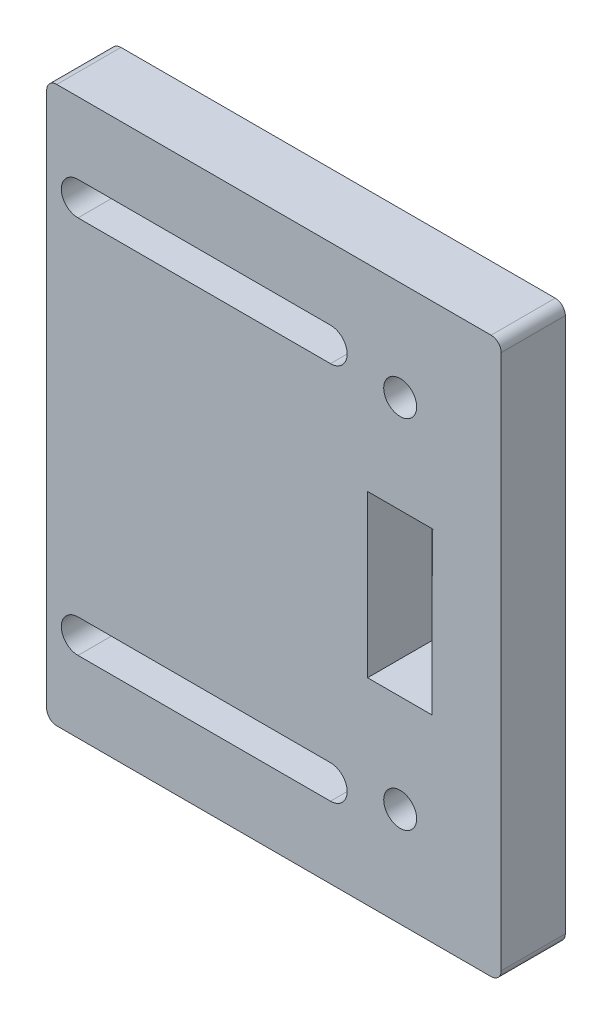
ISO-10303-21;
HEADER;
FILE_DESCRIPTION(('STEP AP214'),'2;1');
FILE_NAME('part.step','',(''),(''),'','','');
FILE_SCHEMA(('AUTOMOTIVE_DESIGN { 1 0 10303 214 1 1 1 1 }'));
ENDSEC;
DATA;
#1=APPLICATION_CONTEXT('core data for automotive mechanical design processes');
#2=APPLICATION_PROTOCOL_DEFINITION('international standard','automotive_design',2000,#1);
#3=PRODUCT_CONTEXT('',#1,'mechanical');
#4=PRODUCT('Part','Part','',(#3));
#5=PRODUCT_RELATED_PRODUCT_CATEGORY('part','',(#4));
#6=PRODUCT_DEFINITION_FORMATION('','',#4);
#7=PRODUCT_DEFINITION_CONTEXT('part definition',#1,'design');
#8=PRODUCT_DEFINITION('design','',#6,#7);
#9=PRODUCT_DEFINITION_SHAPE('','',#8);
#10=(LENGTH_UNIT() NAMED_UNIT(*) SI_UNIT(.MILLI.,.METRE.));
#11=(NAMED_UNIT(*) PLANE_ANGLE_UNIT() SI_UNIT($,.RADIAN.));
#12=(NAMED_UNIT(*) SI_UNIT($,.STERADIAN.) SOLID_ANGLE_UNIT());
#13=UNCERTAINTY_MEASURE_WITH_UNIT(LENGTH_MEASURE(1.E-05),#10,'distance_accuracy_value','');
#14=(GEOMETRIC_REPRESENTATION_CONTEXT(3) GLOBAL_UNCERTAINTY_ASSIGNED_CONTEXT((#13)) GLOBAL_UNIT_ASSIGNED_CONTEXT((#10,
#11,#12)) REPRESENTATION_CONTEXT('',''));
#15=CARTESIAN_POINT('',(0.,0.,0.));
#16=DIRECTION('',(0.,0.,1.));
#17=DIRECTION('',(1.,0.,0.));
#18=AXIS2_PLACEMENT_3D('',#15,#16,#17);
#19=CARTESIAN_POINT('',(0.,0.,0.));
#20=DIRECTION('',(0.,0.,1.));
#21=DIRECTION('',(1.,0.,0.));
#22=AXIS2_PLACEMENT_3D('',#19,#20,#21);
#23=PLANE('',#22);
#24=DIRECTION('',(-1.,0.,0.));
#25=VECTOR('',#24,1.);
#26=CARTESIAN_POINT('',(56.200253658406,-20.785,0.));
#27=LINE('',#26,#25);
#28=CARTESIAN_POINT('',(56.200253658406,-20.785,0.));
#29=VERTEX_POINT('',#28);
#30=CARTESIAN_POINT('',(6.20025365840605,-20.785,0.));
#31=VERTEX_POINT('',#30);
#32=EDGE_CURVE('E209',#29,#31,#27,.T.);
#33=ORIENTED_EDGE('',*,*,#32,.F.);
#34=CARTESIAN_POINT('',(56.200253658406,-17.485,0.));
#35=DIRECTION('',(0.,0.,-1.));
#36=DIRECTION('',(1.,0.,0.));
#37=AXIS2_PLACEMENT_3D('',#34,#35,#36);
#38=CIRCLE('',#37,3.30000000000001);
#39=CARTESIAN_POINT('',(56.200253658406,-14.185,0.));
#40=VERTEX_POINT('',#39);
#41=EDGE_CURVE('E51',#40,#29,#38,.T.);
#42=ORIENTED_EDGE('',*,*,#41,.F.);
#43=DIRECTION('',(1.,0.,0.));
#44=VECTOR('',#43,1.);
#45=CARTESIAN_POINT('',(56.200253658406,-14.185,0.));
#46=LINE('',#45,#44);
#47=CARTESIAN_POINT('',(6.20025365840605,-14.185,0.));
#48=VERTEX_POINT('',#47);
#49=EDGE_CURVE('E200',#48,#40,#46,.T.);
#50=ORIENTED_EDGE('',*,*,#49,.F.);
#51=CARTESIAN_POINT('',(6.20025365840605,-17.485,0.));
#52=DIRECTION('',(0.,0.,-1.));
#53=DIRECTION('',(1.,0.,0.));
#54=AXIS2_PLACEMENT_3D('',#51,#52,#53);
#55=CIRCLE('',#54,3.3);
#56=EDGE_CURVE('E203',#31,#48,#55,.T.);
#57=ORIENTED_EDGE('',*,*,#56,.F.);
#58=EDGE_LOOP('',(#33,#42,#50,#57));
#59=FACE_BOUND('',#58,.T.);
#60=DIRECTION('',(-1.,0.,0.));
#61=VECTOR('',#60,1.);
#62=CARTESIAN_POINT('',(56.200253658406,-95.815,0.));
#63=LINE('',#62,#61);
#64=CARTESIAN_POINT('',(56.200253658406,-95.815,0.));
#65=VERTEX_POINT('',#64);
#66=CARTESIAN_POINT('',(6.20025365840604,-95.815,0.));
#67=VERTEX_POINT('',#66);
#68=EDGE_CURVE('E235',#65,#67,#63,.T.);
#69=ORIENTED_EDGE('',*,*,#68,.F.);
#70=CARTESIAN_POINT('',(56.200253658406,-92.515,0.));
#71=DIRECTION('',(0.,0.,-1.));
#72=DIRECTION('',(-1.,0.,0.));
#73=AXIS2_PLACEMENT_3D('',#70,#71,#72);
#74=CIRCLE('',#73,3.3);
#75=CARTESIAN_POINT('',(56.200253658406,-89.215,0.));
#76=VERTEX_POINT('',#75);
#77=EDGE_CURVE('E59',#76,#65,#74,.T.);
#78=ORIENTED_EDGE('',*,*,#77,.F.);
#79=DIRECTION('',(1.,0.,0.));
#80=VECTOR('',#79,1.);
#81=CARTESIAN_POINT('',(56.200253658406,-89.215,0.));
#82=LINE('',#81,#80);
#83=CARTESIAN_POINT('',(6.20025365840604,-89.215,0.));
#84=VERTEX_POINT('',#83);
#85=EDGE_CURVE('E224',#84,#76,#82,.T.);
#86=ORIENTED_EDGE('',*,*,#85,.F.);
#87=CARTESIAN_POINT('',(6.20025365840604,-92.515,0.));
#88=DIRECTION('',(0.,0.,-1.));
#89=DIRECTION('',(-1.,0.,0.));
#90=AXIS2_PLACEMENT_3D('',#87,#88,#89);
#91=CIRCLE('',#90,3.3);
#92=EDGE_CURVE('E238',#67,#84,#91,.T.);
#93=ORIENTED_EDGE('',*,*,#92,.F.);
#94=EDGE_LOOP('',(#69,#78,#86,#93));
#95=FACE_BOUND('',#94,.T.);
#96=CARTESIAN_POINT('',(70.,-19.69,0.));
#97=DIRECTION('',(0.,0.,-1.));
#98=DIRECTION('',(-1.,0.,0.));
#99=AXIS2_PLACEMENT_3D('',#96,#97,#98);
#100=CIRCLE('',#99,6.4389);
#101=CARTESIAN_POINT('',(63.5611,-19.69,0.));
#102=VERTEX_POINT('',#101);
#103=EDGE_CURVE('E216',#102,#102,#100,.T.);
#104=ORIENTED_EDGE('',*,*,#103,.F.);
#105=EDGE_LOOP('',(#104));
#106=FACE_BOUND('',#105,.T.);
#107=DIRECTION('',(0.,-1.,0.));
#108=VECTOR('',#107,1.);
#109=CARTESIAN_POINT('',(0.,0.,0.));
#110=LINE('',#109,#108);
#111=CARTESIAN_POINT('',(0.,-2.,0.));
#112=VERTEX_POINT('',#111);
#113=CARTESIAN_POINT('',(0.,-108.,0.));
#114=VERTEX_POINT('',#113);
#115=EDGE_CURVE('E303',#112,#114,#110,.T.);
#116=ORIENTED_EDGE('',*,*,#115,.F.);
#117=CARTESIAN_POINT('',(2.,-2.,0.));
#118=DIRECTION('',(0.,0.,1.));
#119=DIRECTION('',(1.,0.,0.));
#120=AXIS2_PLACEMENT_3D('',#117,#118,#119);
#121=CIRCLE('',#120,2.);
#122=CARTESIAN_POINT('',(2.,0.,0.));
#123=VERTEX_POINT('',#122);
#124=EDGE_CURVE('E338',#112,#123,#121,.F.);
#125=ORIENTED_EDGE('',*,*,#124,.T.);
#126=DIRECTION('',(-1.,0.,0.));
#127=VECTOR('',#126,1.);
#128=CARTESIAN_POINT('',(0.,0.,0.));
#129=LINE('',#128,#127);
#130=CARTESIAN_POINT('',(88.,0.,0.));
#131=VERTEX_POINT('',#130);
#132=EDGE_CURVE('E308',#131,#123,#129,.T.);
#133=ORIENTED_EDGE('',*,*,#132,.F.);
#134=CARTESIAN_POINT('',(88.,-2.,0.));
#135=DIRECTION('',(0.,0.,1.));
#136=DIRECTION('',(1.,0.,0.));
#137=AXIS2_PLACEMENT_3D('',#134,#135,#136);
#138=CIRCLE('',#137,2.);
#139=CARTESIAN_POINT('',(90.,-2.,0.));
#140=VERTEX_POINT('',#139);
#141=EDGE_CURVE('E336',#131,#140,#138,.F.);
#142=ORIENTED_EDGE('',*,*,#141,.T.);
#143=DIRECTION('',(0.,1.,0.));
#144=VECTOR('',#143,1.);
#145=CARTESIAN_POINT('',(90.,0.,0.));
#146=LINE('',#145,#144);
#147=CARTESIAN_POINT('',(90.,-108.,0.));
#148=VERTEX_POINT('',#147);
#149=EDGE_CURVE('E323',#148,#140,#146,.T.);
#150=ORIENTED_EDGE('',*,*,#149,.F.);
#151=CARTESIAN_POINT('',(88.,-108.,0.));
#152=DIRECTION('',(0.,0.,1.));
#153=DIRECTION('',(1.,0.,0.));
#154=AXIS2_PLACEMENT_3D('',#151,#152,#153);
#155=CIRCLE('',#154,2.);
#156=CARTESIAN_POINT('',(88.,-110.,0.));
#157=VERTEX_POINT('',#156);
#158=EDGE_CURVE('E332',#148,#157,#155,.F.);
#159=ORIENTED_EDGE('',*,*,#158,.T.);
#160=DIRECTION('',(1.,0.,0.));
#161=VECTOR('',#160,1.);
#162=CARTESIAN_POINT('',(0.,-110.,0.));
#163=LINE('',#162,#161);
#164=CARTESIAN_POINT('',(2.,-110.,0.));
#165=VERTEX_POINT('',#164);
#166=EDGE_CURVE('E320',#165,#157,#163,.T.);
#167=ORIENTED_EDGE('',*,*,#166,.F.);
#168=CARTESIAN_POINT('',(2.,-108.,0.));
#169=DIRECTION('',(0.,0.,1.));
#170=DIRECTION('',(1.,0.,0.));
#171=AXIS2_PLACEMENT_3D('',#168,#169,#170);
#172=CIRCLE('',#171,2.);
#173=EDGE_CURVE('E334',#165,#114,#172,.F.);
#174=ORIENTED_EDGE('',*,*,#173,.T.);
#175=EDGE_LOOP('',(#116,#125,#133,#142,#150,#159,#167,#174));
#176=FACE_BOUND('',#175,.T.);
#177=DIRECTION('',(0.,-1.,0.));
#178=VECTOR('',#177,1.);
#179=CARTESIAN_POINT('',(63.55,-70.9756259780908,0.));
#180=LINE('',#179,#178);
#181=CARTESIAN_POINT('',(63.55,-39.0256259780908,0.));
#182=VERTEX_POINT('',#181);
#183=CARTESIAN_POINT('',(63.55,-70.9756259780908,0.));
#184=VERTEX_POINT('',#183);
#185=EDGE_CURVE('E266',#182,#184,#180,.T.);
#186=ORIENTED_EDGE('',*,*,#185,.T.);
#187=DIRECTION('',(1.,0.,0.));
#188=VECTOR('',#187,1.);
#189=CARTESIAN_POINT('',(76.2499999999986,-70.9756259780908,0.));
#190=LINE('',#189,#188);
#191=CARTESIAN_POINT('',(76.2499999999986,-70.9756259780908,0.));
#192=VERTEX_POINT('',#191);
#193=EDGE_CURVE('E282',#184,#192,#190,.T.);
#194=ORIENTED_EDGE('',*,*,#193,.T.);
#195=DIRECTION('',(0.,1.,0.));
#196=VECTOR('',#195,1.);
#197=CARTESIAN_POINT('',(76.2499999999986,-55.,0.));
#198=LINE('',#197,#196);
#199=CARTESIAN_POINT('',(76.2499999999986,-55.,0.));
#200=VERTEX_POINT('',#199);
#201=EDGE_CURVE('E285',#192,#200,#198,.T.);
#202=ORIENTED_EDGE('',*,*,#201,.T.);
#203=DIRECTION('',(0.0125190712574074,0.999921633356761,0.));
#204=VECTOR('',#203,1.);
#205=CARTESIAN_POINT('',(76.45,-39.0256259780908,0.));
#206=LINE('',#205,#204);
#207=CARTESIAN_POINT('',(76.45,-39.0256259780908,0.));
#208=VERTEX_POINT('',#207);
#209=EDGE_CURVE('E288',#200,#208,#206,.T.);
#210=ORIENTED_EDGE('',*,*,#209,.T.);
#211=DIRECTION('',(-1.,0.,0.));
#212=VECTOR('',#211,1.);
#213=CARTESIAN_POINT('',(70.,-39.0256259780908,0.));
#214=LINE('',#213,#212);
#215=EDGE_CURVE('E270',#208,#182,#214,.T.);
#216=ORIENTED_EDGE('',*,*,#215,.T.);
#217=EDGE_LOOP('',(#186,#194,#202,#210,#216));
#218=FACE_BOUND('',#217,.T.);
#219=CARTESIAN_POINT('',(70.,-90.31,0.));
#220=DIRECTION('',(0.,0.,-1.));
#221=DIRECTION('',(-1.,0.,0.));
#222=AXIS2_PLACEMENT_3D('',#219,#220,#221);
#223=CIRCLE('',#222,6.4389);
#224=CARTESIAN_POINT('',(63.5611,-90.31,0.));
#225=VERTEX_POINT('',#224);
#226=EDGE_CURVE('E257',#225,#225,#223,.T.);
#227=ORIENTED_EDGE('',*,*,#226,.F.);
#228=EDGE_LOOP('',(#227));
#229=FACE_BOUND('',#228,.T.);
#230=ADVANCED_FACE('F36',(#59,#95,#106,#176,#218,#229),#23,.F.);
#231=CARTESIAN_POINT('',(0.,0.,12.7));
#232=DIRECTION('',(0.,0.,1.));
#233=DIRECTION('',(1.,0.,0.));
#234=AXIS2_PLACEMENT_3D('',#231,#232,#233);
#235=PLANE('',#234);
#236=CARTESIAN_POINT('',(56.200253658406,-17.485,12.7));
#237=DIRECTION('',(0.,0.,-1.));
#238=DIRECTION('',(1.,0.,0.));
#239=AXIS2_PLACEMENT_3D('',#236,#237,#238);
#240=CIRCLE('',#239,3.30000000000001);
#241=CARTESIAN_POINT('',(56.200253658406,-14.185,12.7));
#242=VERTEX_POINT('',#241);
#243=CARTESIAN_POINT('',(56.200253658406,-20.785,12.7));
#244=VERTEX_POINT('',#243);
#245=EDGE_CURVE('E181',#242,#244,#240,.T.);
#246=ORIENTED_EDGE('',*,*,#245,.T.);
#247=DIRECTION('',(-1.,0.,0.));
#248=VECTOR('',#247,1.);
#249=CARTESIAN_POINT('',(56.200253658406,-20.785,12.7));
#250=LINE('',#249,#248);
#251=CARTESIAN_POINT('',(6.20025365840605,-20.785,12.7));
#252=VERTEX_POINT('',#251);
#253=EDGE_CURVE('E191',#244,#252,#250,.T.);
#254=ORIENTED_EDGE('',*,*,#253,.T.);
#255=CARTESIAN_POINT('',(6.20025365840605,-17.485,12.7));
#256=DIRECTION('',(0.,0.,-1.));
#257=DIRECTION('',(1.,0.,0.));
#258=AXIS2_PLACEMENT_3D('',#255,#256,#257);
#259=CIRCLE('',#258,3.3);
#260=CARTESIAN_POINT('',(6.20025365840605,-14.185,12.7));
#261=VERTEX_POINT('',#260);
#262=EDGE_CURVE('E195',#252,#261,#259,.T.);
#263=ORIENTED_EDGE('',*,*,#262,.T.);
#264=DIRECTION('',(1.,0.,0.));
#265=VECTOR('',#264,1.);
#266=CARTESIAN_POINT('',(56.200253658406,-14.185,12.7));
#267=LINE('',#266,#265);
#268=EDGE_CURVE('E187',#261,#242,#267,.T.);
#269=ORIENTED_EDGE('',*,*,#268,.T.);
#270=EDGE_LOOP('',(#246,#254,#263,#269));
#271=FACE_BOUND('',#270,.T.);
#272=CARTESIAN_POINT('',(56.200253658406,-92.515,12.7));
#273=DIRECTION('',(0.,0.,-1.));
#274=DIRECTION('',(-1.,0.,0.));
#275=AXIS2_PLACEMENT_3D('',#272,#273,#274);
#276=CIRCLE('',#275,3.3);
#277=CARTESIAN_POINT('',(56.200253658406,-89.215,12.7));
#278=VERTEX_POINT('',#277);
#279=CARTESIAN_POINT('',(56.200253658406,-95.815,12.7));
#280=VERTEX_POINT('',#279);
#281=EDGE_CURVE('E220',#278,#280,#276,.T.);
#282=ORIENTED_EDGE('',*,*,#281,.T.);
#283=DIRECTION('',(-1.,0.,0.));
#284=VECTOR('',#283,1.);
#285=CARTESIAN_POINT('',(56.200253658406,-95.815,12.7));
#286=LINE('',#285,#284);
#287=CARTESIAN_POINT('',(6.20025365840604,-95.815,12.7));
#288=VERTEX_POINT('',#287);
#289=EDGE_CURVE('E223',#280,#288,#286,.T.);
#290=ORIENTED_EDGE('',*,*,#289,.T.);
#291=CARTESIAN_POINT('',(6.20025365840604,-92.515,12.7));
#292=DIRECTION('',(0.,0.,-1.));
#293=DIRECTION('',(-1.,0.,0.));
#294=AXIS2_PLACEMENT_3D('',#291,#292,#293);
#295=CIRCLE('',#294,3.3);
#296=CARTESIAN_POINT('',(6.20025365840604,-89.215,12.7));
#297=VERTEX_POINT('',#296);
#298=EDGE_CURVE('E227',#288,#297,#295,.T.);
#299=ORIENTED_EDGE('',*,*,#298,.T.);
#300=DIRECTION('',(1.,0.,0.));
#301=VECTOR('',#300,1.);
#302=CARTESIAN_POINT('',(56.200253658406,-89.215,12.7));
#303=LINE('',#302,#301);
#304=EDGE_CURVE('E230',#297,#278,#303,.T.);
#305=ORIENTED_EDGE('',*,*,#304,.T.);
#306=EDGE_LOOP('',(#282,#290,#299,#305));
#307=FACE_BOUND('',#306,.T.);
#308=CARTESIAN_POINT('',(70.,-19.69,12.7));
#309=DIRECTION('',(0.,0.,-1.));
#310=DIRECTION('',(-1.,0.,0.));
#311=AXIS2_PLACEMENT_3D('',#308,#309,#310);
#312=CIRCLE('',#311,3.26389999999999);
#313=CARTESIAN_POINT('',(66.7361,-19.69,12.7));
#314=VERTEX_POINT('',#313);
#315=EDGE_CURVE('E254',#314,#314,#312,.T.);
#316=ORIENTED_EDGE('',*,*,#315,.T.);
#317=EDGE_LOOP('',(#316));
#318=FACE_BOUND('',#317,.T.);
#319=CARTESIAN_POINT('',(70.,-90.31,12.7));
#320=DIRECTION('',(0.,0.,-1.));
#321=DIRECTION('',(-1.,0.,0.));
#322=AXIS2_PLACEMENT_3D('',#319,#320,#321);
#323=CIRCLE('',#322,3.26389999999999);
#324=CARTESIAN_POINT('',(66.7361,-90.31,12.7));
#325=VERTEX_POINT('',#324);
#326=EDGE_CURVE('E263',#325,#325,#323,.T.);
#327=ORIENTED_EDGE('',*,*,#326,.T.);
#328=EDGE_LOOP('',(#327));
#329=FACE_BOUND('',#328,.T.);
#330=DIRECTION('',(-1.,0.,0.));
#331=VECTOR('',#330,1.);
#332=CARTESIAN_POINT('',(0.,0.,12.7));
#333=LINE('',#332,#331);
#334=CARTESIAN_POINT('',(88.,0.,12.7));
#335=VERTEX_POINT('',#334);
#336=CARTESIAN_POINT('',(2.,0.,12.7));
#337=VERTEX_POINT('',#336);
#338=EDGE_CURVE('E314',#335,#337,#333,.T.);
#339=ORIENTED_EDGE('',*,*,#338,.T.);
#340=CARTESIAN_POINT('',(2.,-2.,12.7));
#341=DIRECTION('',(0.,0.,1.));
#342=DIRECTION('',(1.,0.,0.));
#343=AXIS2_PLACEMENT_3D('',#340,#341,#342);
#344=CIRCLE('',#343,2.);
#345=CARTESIAN_POINT('',(0.,-2.,12.7));
#346=VERTEX_POINT('',#345);
#347=EDGE_CURVE('E351',#337,#346,#344,.T.);
#348=ORIENTED_EDGE('',*,*,#347,.T.);
#349=DIRECTION('',(0.,-1.,0.));
#350=VECTOR('',#349,1.);
#351=CARTESIAN_POINT('',(0.,0.,12.7));
#352=LINE('',#351,#350);
#353=CARTESIAN_POINT('',(0.,-108.,12.7));
#354=VERTEX_POINT('',#353);
#355=EDGE_CURVE('E304',#346,#354,#352,.T.);
#356=ORIENTED_EDGE('',*,*,#355,.T.);
#357=CARTESIAN_POINT('',(2.,-108.,12.7));
#358=DIRECTION('',(0.,0.,1.));
#359=DIRECTION('',(1.,0.,0.));
#360=AXIS2_PLACEMENT_3D('',#357,#358,#359);
#361=CIRCLE('',#360,2.);
#362=CARTESIAN_POINT('',(2.,-110.,12.7));
#363=VERTEX_POINT('',#362);
#364=EDGE_CURVE('E347',#354,#363,#361,.T.);
#365=ORIENTED_EDGE('',*,*,#364,.T.);
#366=DIRECTION('',(1.,0.,0.));
#367=VECTOR('',#366,1.);
#368=CARTESIAN_POINT('',(0.,-110.,12.7));
#369=LINE('',#368,#367);
#370=CARTESIAN_POINT('',(88.,-110.,12.7));
#371=VERTEX_POINT('',#370);
#372=EDGE_CURVE('E307',#363,#371,#369,.T.);
#373=ORIENTED_EDGE('',*,*,#372,.T.);
#374=CARTESIAN_POINT('',(88.,-108.,12.7));
#375=DIRECTION('',(0.,0.,1.));
#376=DIRECTION('',(1.,0.,0.));
#377=AXIS2_PLACEMENT_3D('',#374,#375,#376);
#378=CIRCLE('',#377,2.);
#379=CARTESIAN_POINT('',(90.,-108.,12.7));
#380=VERTEX_POINT('',#379);
#381=EDGE_CURVE('E345',#371,#380,#378,.T.);
#382=ORIENTED_EDGE('',*,*,#381,.T.);
#383=DIRECTION('',(0.,1.,0.));
#384=VECTOR('',#383,1.);
#385=CARTESIAN_POINT('',(90.,0.,12.7));
#386=LINE('',#385,#384);
#387=CARTESIAN_POINT('',(90.,-2.,12.7));
#388=VERTEX_POINT('',#387);
#389=EDGE_CURVE('E311',#380,#388,#386,.T.);
#390=ORIENTED_EDGE('',*,*,#389,.T.);
#391=CARTESIAN_POINT('',(88.,-2.,12.7));
#392=DIRECTION('',(0.,0.,1.));
#393=DIRECTION('',(1.,0.,0.));
#394=AXIS2_PLACEMENT_3D('',#391,#392,#393);
#395=CIRCLE('',#394,2.);
#396=EDGE_CURVE('E349',#388,#335,#395,.T.);
#397=ORIENTED_EDGE('',*,*,#396,.T.);
#398=EDGE_LOOP('',(#339,#348,#356,#365,#373,#382,#390,#397));
#399=FACE_BOUND('',#398,.T.);
#400=DIRECTION('',(1.,0.,0.));
#401=VECTOR('',#400,1.);
#402=CARTESIAN_POINT('',(70.,-70.9756259780908,12.7));
#403=LINE('',#402,#401);
#404=CARTESIAN_POINT('',(63.55,-70.9756259780908,12.7));
#405=VERTEX_POINT('',#404);
#406=CARTESIAN_POINT('',(76.2499999999986,-70.9756259780908,12.7));
#407=VERTEX_POINT('',#406);
#408=EDGE_CURVE('E272',#405,#407,#403,.T.);
#409=ORIENTED_EDGE('',*,*,#408,.F.);
#410=DIRECTION('',(0.,-1.,0.));
#411=VECTOR('',#410,1.);
#412=CARTESIAN_POINT('',(63.55,-70.9756259780908,12.7));
#413=LINE('',#412,#411);
#414=CARTESIAN_POINT('',(63.55,-39.0256259780908,12.7));
#415=VERTEX_POINT('',#414);
#416=EDGE_CURVE('E269',#415,#405,#413,.T.);
#417=ORIENTED_EDGE('',*,*,#416,.F.);
#418=DIRECTION('',(-1.,0.,0.));
#419=VECTOR('',#418,1.);
#420=CARTESIAN_POINT('',(63.55,-39.0256259780908,12.7));
#421=LINE('',#420,#419);
#422=CARTESIAN_POINT('',(76.45,-39.0256259780908,12.7));
#423=VERTEX_POINT('',#422);
#424=EDGE_CURVE('E267',#423,#415,#421,.T.);
#425=ORIENTED_EDGE('',*,*,#424,.F.);
#426=DIRECTION('',(0.0125190712574074,0.999921633356761,0.));
#427=VECTOR('',#426,1.);
#428=CARTESIAN_POINT('',(76.45,-39.0256259780908,12.7));
#429=LINE('',#428,#427);
#430=CARTESIAN_POINT('',(76.2499999999986,-55.,12.7));
#431=VERTEX_POINT('',#430);
#432=EDGE_CURVE('E276',#431,#423,#429,.T.);
#433=ORIENTED_EDGE('',*,*,#432,.F.);
#434=DIRECTION('',(0.,1.,0.));
#435=VECTOR('',#434,1.);
#436=CARTESIAN_POINT('',(76.2499999999986,-55.,12.7));
#437=LINE('',#436,#435);
#438=EDGE_CURVE('E274',#407,#431,#437,.T.);
#439=ORIENTED_EDGE('',*,*,#438,.F.);
#440=EDGE_LOOP('',(#409,#417,#425,#433,#439));
#441=FACE_BOUND('',#440,.T.);
#442=ADVANCED_FACE('F197',(#271,#307,#318,#329,#399,#441),#235,.T.);
#443=CARTESIAN_POINT('',(0.,0.,12.7));
#444=DIRECTION('',(1.,0.,0.));
#445=DIRECTION('',(0.,0.,-1.));
#446=AXIS2_PLACEMENT_3D('',#443,#444,#445);
#447=PLANE('',#446);
#448=ORIENTED_EDGE('',*,*,#355,.F.);
#449=DIRECTION('',(0.,0.,-1.));
#450=VECTOR('',#449,1.);
#451=CARTESIAN_POINT('',(0.,-2.,12.7));
#452=LINE('',#451,#450);
#453=EDGE_CURVE('E329',#346,#112,#452,.T.);
#454=ORIENTED_EDGE('',*,*,#453,.T.);
#455=ORIENTED_EDGE('',*,*,#115,.T.);
#456=DIRECTION('',(0.,0.,-1.));
#457=VECTOR('',#456,1.);
#458=CARTESIAN_POINT('',(0.,-108.,12.7));
#459=LINE('',#458,#457);
#460=EDGE_CURVE('E317',#114,#354,#459,.F.);
#461=ORIENTED_EDGE('',*,*,#460,.T.);
#462=EDGE_LOOP('',(#448,#454,#455,#461));
#463=FACE_BOUND('',#462,.T.);
#464=ADVANCED_FACE('F392',(#463),#447,.F.);
#465=CARTESIAN_POINT('',(0.,-110.,12.7));
#466=DIRECTION('',(0.,1.,0.));
#467=DIRECTION('',(0.,0.,1.));
#468=AXIS2_PLACEMENT_3D('',#465,#466,#467);
#469=PLANE('',#468);
#470=ORIENTED_EDGE('',*,*,#372,.F.);
#471=DIRECTION('',(0.,0.,-1.));
#472=VECTOR('',#471,1.);
#473=CARTESIAN_POINT('',(2.,-110.,12.7));
#474=LINE('',#473,#472);
#475=EDGE_CURVE('E11',#363,#165,#474,.T.);
#476=ORIENTED_EDGE('',*,*,#475,.T.);
#477=ORIENTED_EDGE('',*,*,#166,.T.);
#478=DIRECTION('',(0.,0.,-1.));
#479=VECTOR('',#478,1.);
#480=CARTESIAN_POINT('',(88.,-110.,12.7));
#481=LINE('',#480,#479);
#482=EDGE_CURVE('E44',#157,#371,#481,.F.);
#483=ORIENTED_EDGE('',*,*,#482,.T.);
#484=EDGE_LOOP('',(#470,#476,#477,#483));
#485=FACE_BOUND('',#484,.T.);
#486=ADVANCED_FACE('F360',(#485),#469,.F.);
#487=CARTESIAN_POINT('',(90.,0.,12.7));
#488=DIRECTION('',(-1.,0.,0.));
#489=DIRECTION('',(0.,-1.,0.));
#490=AXIS2_PLACEMENT_3D('',#487,#488,#489);
#491=PLANE('',#490);
#492=ORIENTED_EDGE('',*,*,#149,.T.);
#493=DIRECTION('',(0.,0.,-1.));
#494=VECTOR('',#493,1.);
#495=CARTESIAN_POINT('',(90.,-2.,12.7));
#496=LINE('',#495,#494);
#497=EDGE_CURVE('E356',#140,#388,#496,.F.);
#498=ORIENTED_EDGE('',*,*,#497,.T.);
#499=ORIENTED_EDGE('',*,*,#389,.F.);
#500=DIRECTION('',(0.,0.,-1.));
#501=VECTOR('',#500,1.);
#502=CARTESIAN_POINT('',(90.,-108.,12.7));
#503=LINE('',#502,#501);
#504=EDGE_CURVE('E353',#380,#148,#503,.T.);
#505=ORIENTED_EDGE('',*,*,#504,.T.);
#506=EDGE_LOOP('',(#492,#498,#499,#505));
#507=FACE_BOUND('',#506,.T.);
#508=ADVANCED_FACE('F372',(#507),#491,.F.);
#509=CARTESIAN_POINT('',(0.,0.,12.7));
#510=DIRECTION('',(0.,-1.,0.));
#511=DIRECTION('',(0.,0.,-1.));
#512=AXIS2_PLACEMENT_3D('',#509,#510,#511);
#513=PLANE('',#512);
#514=ORIENTED_EDGE('',*,*,#132,.T.);
#515=DIRECTION('',(0.,0.,-1.));
#516=VECTOR('',#515,1.);
#517=CARTESIAN_POINT('',(2.,0.,12.7));
#518=LINE('',#517,#516);
#519=EDGE_CURVE('E343',#123,#337,#518,.F.);
#520=ORIENTED_EDGE('',*,*,#519,.T.);
#521=ORIENTED_EDGE('',*,*,#338,.F.);
#522=DIRECTION('',(0.,0.,-1.));
#523=VECTOR('',#522,1.);
#524=CARTESIAN_POINT('',(88.,0.,12.7));
#525=LINE('',#524,#523);
#526=EDGE_CURVE('E340',#335,#131,#525,.T.);
#527=ORIENTED_EDGE('',*,*,#526,.T.);
#528=EDGE_LOOP('',(#514,#520,#521,#527));
#529=FACE_BOUND('',#528,.T.);
#530=ADVANCED_FACE('F384',(#529),#513,.F.);
#531=CARTESIAN_POINT('',(63.55,-70.9756259780908,12.7));
#532=DIRECTION('',(1.,0.,0.));
#533=DIRECTION('',(0.,0.,-1.));
#534=AXIS2_PLACEMENT_3D('',#531,#532,#533);
#535=PLANE('',#534);
#536=ORIENTED_EDGE('',*,*,#185,.F.);
#537=DIRECTION('',(0.,0.,-1.));
#538=VECTOR('',#537,1.);
#539=CARTESIAN_POINT('',(63.55,-39.0256259780908,12.7));
#540=LINE('',#539,#538);
#541=EDGE_CURVE('E301',#415,#182,#540,.T.);
#542=ORIENTED_EDGE('',*,*,#541,.F.);
#543=ORIENTED_EDGE('',*,*,#416,.T.);
#544=DIRECTION('',(0.,0.,-1.));
#545=VECTOR('',#544,1.);
#546=CARTESIAN_POINT('',(63.55,-70.9756259780908,12.7));
#547=LINE('',#546,#545);
#548=EDGE_CURVE('E298',#405,#184,#547,.T.);
#549=ORIENTED_EDGE('',*,*,#548,.T.);
#550=EDGE_LOOP('',(#536,#542,#543,#549));
#551=FACE_BOUND('',#550,.T.);
#552=ADVANCED_FACE('F415',(#551),#535,.T.);
#553=CARTESIAN_POINT('',(76.2499999999986,-70.9756259780908,12.7));
#554=DIRECTION('',(0.,1.,0.));
#555=DIRECTION('',(-1.,0.,0.));
#556=AXIS2_PLACEMENT_3D('',#553,#554,#555);
#557=PLANE('',#556);
#558=ORIENTED_EDGE('',*,*,#193,.F.);
#559=ORIENTED_EDGE('',*,*,#548,.F.);
#560=ORIENTED_EDGE('',*,*,#408,.T.);
#561=DIRECTION('',(0.,0.,-1.));
#562=VECTOR('',#561,1.);
#563=CARTESIAN_POINT('',(76.2499999999986,-70.9756259780908,12.7));
#564=LINE('',#563,#562);
#565=EDGE_CURVE('E296',#407,#192,#564,.T.);
#566=ORIENTED_EDGE('',*,*,#565,.T.);
#567=EDGE_LOOP('',(#558,#559,#560,#566));
#568=FACE_BOUND('',#567,.T.);
#569=ADVANCED_FACE('F459',(#568),#557,.T.);
#570=CARTESIAN_POINT('',(76.2499999999986,-55.,12.7));
#571=DIRECTION('',(-1.,0.,0.));
#572=DIRECTION('',(0.,0.,1.));
#573=AXIS2_PLACEMENT_3D('',#570,#571,#572);
#574=PLANE('',#573);
#575=ORIENTED_EDGE('',*,*,#201,.F.);
#576=ORIENTED_EDGE('',*,*,#565,.F.);
#577=ORIENTED_EDGE('',*,*,#438,.T.);
#578=DIRECTION('',(0.,0.,-1.));
#579=VECTOR('',#578,1.);
#580=CARTESIAN_POINT('',(76.2499999999986,-55.,12.7));
#581=LINE('',#580,#579);
#582=EDGE_CURVE('E294',#431,#200,#581,.T.);
#583=ORIENTED_EDGE('',*,*,#582,.T.);
#584=EDGE_LOOP('',(#575,#576,#577,#583));
#585=FACE_BOUND('',#584,.T.);
#586=ADVANCED_FACE('F455',(#585),#574,.T.);
#587=CARTESIAN_POINT('',(76.45,-39.0256259780908,12.7));
#588=DIRECTION('',(-0.999921633356761,0.0125190712574074,0.));
#589=DIRECTION('',(-0.0125190712574074,-0.999921633356761,0.));
#590=AXIS2_PLACEMENT_3D('',#587,#588,#589);
#591=PLANE('',#590);
#592=ORIENTED_EDGE('',*,*,#209,.F.);
#593=ORIENTED_EDGE('',*,*,#582,.F.);
#594=ORIENTED_EDGE('',*,*,#432,.T.);
#595=DIRECTION('',(0.,0.,-1.));
#596=VECTOR('',#595,1.);
#597=CARTESIAN_POINT('',(76.45,-39.0256259780908,12.7));
#598=LINE('',#597,#596);
#599=EDGE_CURVE('E279',#423,#208,#598,.T.);
#600=ORIENTED_EDGE('',*,*,#599,.T.);
#601=EDGE_LOOP('',(#592,#593,#594,#600));
#602=FACE_BOUND('',#601,.T.);
#603=ADVANCED_FACE('F451',(#602),#591,.T.);
#604=CARTESIAN_POINT('',(70.,-39.0256259780908,12.7));
#605=DIRECTION('',(0.,-1.,0.));
#606=DIRECTION('',(0.,0.,-1.));
#607=AXIS2_PLACEMENT_3D('',#604,#605,#606);
#608=PLANE('',#607);
#609=ORIENTED_EDGE('',*,*,#215,.F.);
#610=ORIENTED_EDGE('',*,*,#599,.F.);
#611=ORIENTED_EDGE('',*,*,#424,.T.);
#612=ORIENTED_EDGE('',*,*,#541,.T.);
#613=EDGE_LOOP('',(#609,#610,#611,#612));
#614=FACE_BOUND('',#613,.T.);
#615=ADVANCED_FACE('F447',(#614),#608,.T.);
#616=CARTESIAN_POINT('',(70.,-90.31,0.));
#617=DIRECTION('',(0.,0.,-1.));
#618=DIRECTION('',(-1.,0.,0.));
#619=AXIS2_PLACEMENT_3D('',#616,#617,#618);
#620=CYLINDRICAL_SURFACE('',#619,3.26389999999999);
#621=ORIENTED_EDGE('',*,*,#326,.F.);
#622=EDGE_LOOP('',(#621));
#623=FACE_BOUND('',#622,.T.);
#624=CARTESIAN_POINT('',(70.,-90.31,3.65241969292671));
#625=DIRECTION('',(0.,0.,-1.));
#626=DIRECTION('',(-1.,0.,0.));
#627=AXIS2_PLACEMENT_3D('',#624,#625,#626);
#628=CIRCLE('',#627,3.26389999999999);
#629=CARTESIAN_POINT('',(66.7361,-90.31,3.65241969292671));
#630=VERTEX_POINT('',#629);
#631=EDGE_CURVE('E260',#630,#630,#628,.T.);
#632=ORIENTED_EDGE('',*,*,#631,.T.);
#633=EDGE_LOOP('',(#632));
#634=FACE_BOUND('',#633,.T.);
#635=ADVANCED_FACE('F443',(#623,#634),#620,.F.);
#636=CARTESIAN_POINT('',(70.,-90.31,0.));
#637=DIRECTION('',(0.,0.,-1.));
#638=DIRECTION('',(-1.,0.,0.));
#639=AXIS2_PLACEMENT_3D('',#636,#637,#638);
#640=CONICAL_SURFACE('',#639,6.4389,0.715584993317677);
#641=ORIENTED_EDGE('',*,*,#631,.F.);
#642=EDGE_LOOP('',(#641));
#643=FACE_BOUND('',#642,.T.);
#644=ORIENTED_EDGE('',*,*,#226,.T.);
#645=EDGE_LOOP('',(#644));
#646=FACE_BOUND('',#645,.T.);
#647=ADVANCED_FACE('F433',(#643,#646),#640,.F.);
#648=CARTESIAN_POINT('',(70.,-19.69,0.));
#649=DIRECTION('',(0.,0.,-1.));
#650=DIRECTION('',(-1.,0.,0.));
#651=AXIS2_PLACEMENT_3D('',#648,#649,#650);
#652=CYLINDRICAL_SURFACE('',#651,3.26389999999999);
#653=ORIENTED_EDGE('',*,*,#315,.F.);
#654=EDGE_LOOP('',(#653));
#655=FACE_BOUND('',#654,.T.);
#656=CARTESIAN_POINT('',(70.,-19.69,3.65241969292671));
#657=DIRECTION('',(0.,0.,-1.));
#658=DIRECTION('',(-1.,0.,0.));
#659=AXIS2_PLACEMENT_3D('',#656,#657,#658);
#660=CIRCLE('',#659,3.26389999999999);
#661=CARTESIAN_POINT('',(66.7361,-19.69,3.65241969292671));
#662=VERTEX_POINT('',#661);
#663=EDGE_CURVE('E251',#662,#662,#660,.T.);
#664=ORIENTED_EDGE('',*,*,#663,.T.);
#665=EDGE_LOOP('',(#664));
#666=FACE_BOUND('',#665,.T.);
#667=ADVANCED_FACE('F427',(#655,#666),#652,.F.);
#668=CARTESIAN_POINT('',(70.,-19.69,0.));
#669=DIRECTION('',(0.,0.,-1.));
#670=DIRECTION('',(-1.,0.,0.));
#671=AXIS2_PLACEMENT_3D('',#668,#669,#670);
#672=CONICAL_SURFACE('',#671,6.4389,0.715584993317677);
#673=ORIENTED_EDGE('',*,*,#663,.F.);
#674=EDGE_LOOP('',(#673));
#675=FACE_BOUND('',#674,.T.);
#676=ORIENTED_EDGE('',*,*,#103,.T.);
#677=EDGE_LOOP('',(#676));
#678=FACE_BOUND('',#677,.T.);
#679=ADVANCED_FACE('F423',(#675,#678),#672,.F.);
#680=CARTESIAN_POINT('',(2.,-2.,12.7));
#681=DIRECTION('',(0.,0.,-1.));
#682=DIRECTION('',(-1.,0.,0.));
#683=AXIS2_PLACEMENT_3D('',#680,#681,#682);
#684=CYLINDRICAL_SURFACE('',#683,2.);
#685=ORIENTED_EDGE('',*,*,#347,.F.);
#686=ORIENTED_EDGE('',*,*,#519,.F.);
#687=ORIENTED_EDGE('',*,*,#124,.F.);
#688=ORIENTED_EDGE('',*,*,#453,.F.);
#689=EDGE_LOOP('',(#685,#686,#687,#688));
#690=FACE_BOUND('',#689,.T.);
#691=ADVANCED_FACE('F390',(#690),#684,.T.);
#692=CARTESIAN_POINT('',(88.,-2.,12.7));
#693=DIRECTION('',(0.,0.,-1.));
#694=DIRECTION('',(-1.,0.,0.));
#695=AXIS2_PLACEMENT_3D('',#692,#693,#694);
#696=CYLINDRICAL_SURFACE('',#695,2.);
#697=ORIENTED_EDGE('',*,*,#396,.F.);
#698=ORIENTED_EDGE('',*,*,#497,.F.);
#699=ORIENTED_EDGE('',*,*,#141,.F.);
#700=ORIENTED_EDGE('',*,*,#526,.F.);
#701=EDGE_LOOP('',(#697,#698,#699,#700));
#702=FACE_BOUND('',#701,.T.);
#703=ADVANCED_FACE('F381',(#702),#696,.T.);
#704=CARTESIAN_POINT('',(2.,-108.,12.7));
#705=DIRECTION('',(0.,0.,-1.));
#706=DIRECTION('',(-1.,0.,0.));
#707=AXIS2_PLACEMENT_3D('',#704,#705,#706);
#708=CYLINDRICAL_SURFACE('',#707,2.);
#709=ORIENTED_EDGE('',*,*,#364,.F.);
#710=ORIENTED_EDGE('',*,*,#460,.F.);
#711=ORIENTED_EDGE('',*,*,#173,.F.);
#712=ORIENTED_EDGE('',*,*,#475,.F.);
#713=EDGE_LOOP('',(#709,#710,#711,#712));
#714=FACE_BOUND('',#713,.T.);
#715=ADVANCED_FACE('F395',(#714),#708,.T.);
#716=CARTESIAN_POINT('',(88.,-108.,12.7));
#717=DIRECTION('',(0.,0.,-1.));
#718=DIRECTION('',(-1.,0.,0.));
#719=AXIS2_PLACEMENT_3D('',#716,#717,#718);
#720=CYLINDRICAL_SURFACE('',#719,2.);
#721=ORIENTED_EDGE('',*,*,#381,.F.);
#722=ORIENTED_EDGE('',*,*,#482,.F.);
#723=ORIENTED_EDGE('',*,*,#158,.F.);
#724=ORIENTED_EDGE('',*,*,#504,.F.);
#725=EDGE_LOOP('',(#721,#722,#723,#724));
#726=FACE_BOUND('',#725,.T.);
#727=ADVANCED_FACE('F38',(#726),#720,.T.);
#728=CARTESIAN_POINT('',(56.200253658406,-92.515,12.7));
#729=DIRECTION('',(0.,0.,-1.));
#730=DIRECTION('',(-1.,0.,0.));
#731=AXIS2_PLACEMENT_3D('',#728,#729,#730);
#732=CYLINDRICAL_SURFACE('',#731,3.3);
#733=ORIENTED_EDGE('',*,*,#77,.T.);
#734=DIRECTION('',(0.,0.,-1.));
#735=VECTOR('',#734,1.);
#736=CARTESIAN_POINT('',(56.200253658406,-95.815,12.7));
#737=LINE('',#736,#735);
#738=EDGE_CURVE('E233',#280,#65,#737,.T.);
#739=ORIENTED_EDGE('',*,*,#738,.F.);
#740=ORIENTED_EDGE('',*,*,#281,.F.);
#741=DIRECTION('',(0.,0.,-1.));
#742=VECTOR('',#741,1.);
#743=CARTESIAN_POINT('',(56.200253658406,-89.215,12.7));
#744=LINE('',#743,#742);
#745=EDGE_CURVE('E210',#278,#76,#744,.T.);
#746=ORIENTED_EDGE('',*,*,#745,.T.);
#747=EDGE_LOOP('',(#733,#739,#740,#746));
#748=FACE_BOUND('',#747,.T.);
#749=ADVANCED_FACE('F401',(#748),#732,.F.);
#750=CARTESIAN_POINT('',(56.200253658406,-89.215,12.7));
#751=DIRECTION('',(0.,1.,0.));
#752=DIRECTION('',(0.,0.,1.));
#753=AXIS2_PLACEMENT_3D('',#750,#751,#752);
#754=PLANE('',#753);
#755=ORIENTED_EDGE('',*,*,#85,.T.);
#756=ORIENTED_EDGE('',*,*,#745,.F.);
#757=ORIENTED_EDGE('',*,*,#304,.F.);
#758=DIRECTION('',(0.,0.,-1.));
#759=VECTOR('',#758,1.);
#760=CARTESIAN_POINT('',(6.20025365840604,-89.215,12.7));
#761=LINE('',#760,#759);
#762=EDGE_CURVE('E244',#297,#84,#761,.T.);
#763=ORIENTED_EDGE('',*,*,#762,.T.);
#764=EDGE_LOOP('',(#755,#756,#757,#763));
#765=FACE_BOUND('',#764,.T.);
#766=ADVANCED_FACE('F578',(#765),#754,.F.);
#767=CARTESIAN_POINT('',(6.20025365840604,-92.515,12.7));
#768=DIRECTION('',(0.,0.,-1.));
#769=DIRECTION('',(-1.,0.,0.));
#770=AXIS2_PLACEMENT_3D('',#767,#768,#769);
#771=CYLINDRICAL_SURFACE('',#770,3.3);
#772=ORIENTED_EDGE('',*,*,#92,.T.);
#773=ORIENTED_EDGE('',*,*,#762,.F.);
#774=ORIENTED_EDGE('',*,*,#298,.F.);
#775=DIRECTION('',(0.,0.,-1.));
#776=VECTOR('',#775,1.);
#777=CARTESIAN_POINT('',(6.20025365840604,-95.815,12.7));
#778=LINE('',#777,#776);
#779=EDGE_CURVE('E246',#288,#67,#778,.T.);
#780=ORIENTED_EDGE('',*,*,#779,.T.);
#781=EDGE_LOOP('',(#772,#773,#774,#780));
#782=FACE_BOUND('',#781,.T.);
#783=ADVANCED_FACE('F586',(#782),#771,.F.);
#784=CARTESIAN_POINT('',(56.200253658406,-95.815,12.7));
#785=DIRECTION('',(0.,-1.,0.));
#786=DIRECTION('',(1.,0.,0.));
#787=AXIS2_PLACEMENT_3D('',#784,#785,#786);
#788=PLANE('',#787);
#789=ORIENTED_EDGE('',*,*,#68,.T.);
#790=ORIENTED_EDGE('',*,*,#779,.F.);
#791=ORIENTED_EDGE('',*,*,#289,.F.);
#792=ORIENTED_EDGE('',*,*,#738,.T.);
#793=EDGE_LOOP('',(#789,#790,#791,#792));
#794=FACE_BOUND('',#793,.T.);
#795=ADVANCED_FACE('F596',(#794),#788,.F.);
#796=CARTESIAN_POINT('',(56.200253658406,-17.485,12.7));
#797=DIRECTION('',(0.,0.,-1.));
#798=DIRECTION('',(-1.,0.,0.));
#799=AXIS2_PLACEMENT_3D('',#796,#797,#798);
#800=CYLINDRICAL_SURFACE('',#799,3.30000000000001);
#801=ORIENTED_EDGE('',*,*,#41,.T.);
#802=DIRECTION('',(0.,0.,-1.));
#803=VECTOR('',#802,1.);
#804=CARTESIAN_POINT('',(56.200253658406,-20.785,12.7));
#805=LINE('',#804,#803);
#806=EDGE_CURVE('E177',#244,#29,#805,.T.);
#807=ORIENTED_EDGE('',*,*,#806,.F.);
#808=ORIENTED_EDGE('',*,*,#245,.F.);
#809=DIRECTION('',(0.,0.,-1.));
#810=VECTOR('',#809,1.);
#811=CARTESIAN_POINT('',(56.200253658406,-14.185,12.7));
#812=LINE('',#811,#810);
#813=EDGE_CURVE('E214',#242,#40,#812,.T.);
#814=ORIENTED_EDGE('',*,*,#813,.T.);
#815=EDGE_LOOP('',(#801,#807,#808,#814));
#816=FACE_BOUND('',#815,.T.);
#817=ADVANCED_FACE('F179',(#816),#800,.F.);
#818=CARTESIAN_POINT('',(56.200253658406,-14.185,12.7));
#819=DIRECTION('',(0.,1.,0.));
#820=DIRECTION('',(0.,0.,1.));
#821=AXIS2_PLACEMENT_3D('',#818,#819,#820);
#822=PLANE('',#821);
#823=ORIENTED_EDGE('',*,*,#49,.T.);
#824=ORIENTED_EDGE('',*,*,#813,.F.);
#825=ORIENTED_EDGE('',*,*,#268,.F.);
#826=DIRECTION('',(0.,0.,-1.));
#827=VECTOR('',#826,1.);
#828=CARTESIAN_POINT('',(6.20025365840605,-14.185,12.7));
#829=LINE('',#828,#827);
#830=EDGE_CURVE('E217',#261,#48,#829,.T.);
#831=ORIENTED_EDGE('',*,*,#830,.T.);
#832=EDGE_LOOP('',(#823,#824,#825,#831));
#833=FACE_BOUND('',#832,.T.);
#834=ADVANCED_FACE('F614',(#833),#822,.F.);
#835=CARTESIAN_POINT('',(6.20025365840605,-17.485,12.7));
#836=DIRECTION('',(0.,0.,-1.));
#837=DIRECTION('',(-1.,0.,0.));
#838=AXIS2_PLACEMENT_3D('',#835,#836,#837);
#839=CYLINDRICAL_SURFACE('',#838,3.3);
#840=ORIENTED_EDGE('',*,*,#56,.T.);
#841=ORIENTED_EDGE('',*,*,#830,.F.);
#842=ORIENTED_EDGE('',*,*,#262,.F.);
#843=DIRECTION('',(0.,0.,-1.));
#844=VECTOR('',#843,1.);
#845=CARTESIAN_POINT('',(6.20025365840605,-20.785,12.7));
#846=LINE('',#845,#844);
#847=EDGE_CURVE('E186',#252,#31,#846,.T.);
#848=ORIENTED_EDGE('',*,*,#847,.T.);
#849=EDGE_LOOP('',(#840,#841,#842,#848));
#850=FACE_BOUND('',#849,.T.);
#851=ADVANCED_FACE('F623',(#850),#839,.F.);
#852=CARTESIAN_POINT('',(56.200253658406,-20.785,12.7));
#853=DIRECTION('',(0.,-1.,0.));
#854=DIRECTION('',(1.,0.,0.));
#855=AXIS2_PLACEMENT_3D('',#852,#853,#854);
#856=PLANE('',#855);
#857=ORIENTED_EDGE('',*,*,#32,.T.);
#858=ORIENTED_EDGE('',*,*,#847,.F.);
#859=ORIENTED_EDGE('',*,*,#253,.F.);
#860=ORIENTED_EDGE('',*,*,#806,.T.);
#861=EDGE_LOOP('',(#857,#858,#859,#860));
#862=FACE_BOUND('',#861,.T.);
#863=ADVANCED_FACE('F192',(#862),#856,.F.);
#864=CLOSED_SHELL('',(#230,#442,#464,#486,#508,#530,#552,#569,#586,#603,#615,#635,#647,#667,
#679,#691,#703,#715,#727,#749,#766,#783,#795,#817,#834,#851,#863));
#865=MANIFOLD_SOLID_BREP('B2',#864);
#866=ADVANCED_BREP_SHAPE_REPRESENTATION('',(#18,#865),#14);
#867=SHAPE_DEFINITION_REPRESENTATION(#9,#866);
ENDSEC;
END-ISO-10303-21;
